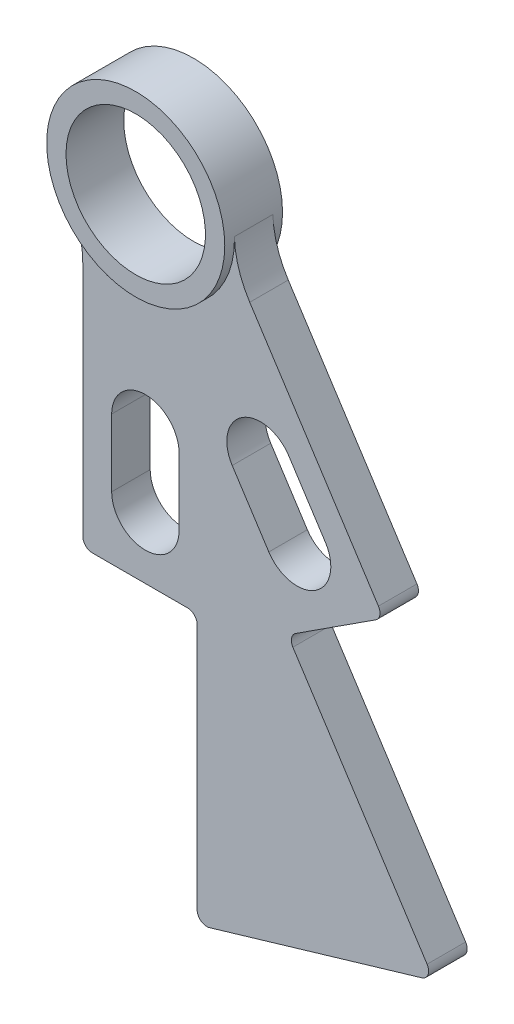
ISO-10303-21;
HEADER;
FILE_DESCRIPTION(('STEP AP214'),'2;1');
FILE_NAME('part.step','',(''),(''),'','','');
FILE_SCHEMA(('AUTOMOTIVE_DESIGN { 1 0 10303 214 1 1 1 1 }'));
ENDSEC;
DATA;
#1=APPLICATION_CONTEXT('core data for automotive mechanical design processes');
#2=APPLICATION_PROTOCOL_DEFINITION('international standard','automotive_design',2000,#1);
#3=PRODUCT_CONTEXT('',#1,'mechanical');
#4=PRODUCT('Part','Part','',(#3));
#5=PRODUCT_RELATED_PRODUCT_CATEGORY('part','',(#4));
#6=PRODUCT_DEFINITION_FORMATION('','',#4);
#7=PRODUCT_DEFINITION_CONTEXT('part definition',#1,'design');
#8=PRODUCT_DEFINITION('design','',#6,#7);
#9=PRODUCT_DEFINITION_SHAPE('','',#8);
#10=(LENGTH_UNIT() NAMED_UNIT(*) SI_UNIT(.MILLI.,.METRE.));
#11=(NAMED_UNIT(*) PLANE_ANGLE_UNIT() SI_UNIT($,.RADIAN.));
#12=(NAMED_UNIT(*) SI_UNIT($,.STERADIAN.) SOLID_ANGLE_UNIT());
#13=UNCERTAINTY_MEASURE_WITH_UNIT(LENGTH_MEASURE(1.E-05),#10,'distance_accuracy_value','');
#14=(GEOMETRIC_REPRESENTATION_CONTEXT(3) GLOBAL_UNCERTAINTY_ASSIGNED_CONTEXT((#13)) GLOBAL_UNIT_ASSIGNED_CONTEXT((#10,
#11,#12)) REPRESENTATION_CONTEXT('',''));
#15=CARTESIAN_POINT('',(0.,0.,0.));
#16=DIRECTION('',(0.,0.,1.));
#17=DIRECTION('',(1.,0.,0.));
#18=AXIS2_PLACEMENT_3D('',#15,#16,#17);
#19=CARTESIAN_POINT('',(0.,0.,4.7625));
#20=DIRECTION('',(0.,0.,-1.));
#21=DIRECTION('',(-1.,0.,0.));
#22=AXIS2_PLACEMENT_3D('',#19,#20,#21);
#23=CYLINDRICAL_SURFACE('',#22,11.495405);
#24=CARTESIAN_POINT('',(0.,0.,4.7625));
#25=DIRECTION('',(0.,0.,1.));
#26=DIRECTION('',(1.,0.,0.));
#27=AXIS2_PLACEMENT_3D('',#24,#25,#26);
#28=CIRCLE('',#27,11.495405);
#29=CARTESIAN_POINT('',(-11.495405,0.,4.7625));
#30=VERTEX_POINT('',#29);
#31=EDGE_CURVE('E278',#30,#30,#28,.T.);
#32=CARTESIAN_POINT('',(0.,0.,-4.7625));
#33=DIRECTION('',(0.,0.,1.));
#34=DIRECTION('',(1.,0.,0.));
#35=AXIS2_PLACEMENT_3D('',#32,#33,#34);
#36=CIRCLE('',#35,11.495405);
#37=CARTESIAN_POINT('',(-11.495405,0.,-4.7625));
#38=VERTEX_POINT('',#37);
#39=EDGE_CURVE('E288',#38,#38,#36,.T.);
#40=CARTESIAN_POINT('',(-11.495405,0.,4.7625));
#41=CARTESIAN_POINT('',(-11.495405,0.,4.66328125));
#42=CARTESIAN_POINT('',(-11.495405,0.,4.5640625));
#43=CARTESIAN_POINT('',(-11.495405,0.,4.365625));
#44=CARTESIAN_POINT('',(-11.495405,0.,4.26640625));
#45=CARTESIAN_POINT('',(-11.495405,0.,4.06796875));
#46=CARTESIAN_POINT('',(-11.495405,0.,3.96875));
#47=CARTESIAN_POINT('',(-11.495405,0.,3.7703125));
#48=CARTESIAN_POINT('',(-11.495405,0.,3.67109375));
#49=CARTESIAN_POINT('',(-11.495405,0.,3.47265625));
#50=CARTESIAN_POINT('',(-11.495405,0.,3.3734375));
#51=CARTESIAN_POINT('',(-11.495405,0.,3.175));
#52=CARTESIAN_POINT('',(-11.495405,0.,3.07578125));
#53=CARTESIAN_POINT('',(-11.495405,0.,2.87734375));
#54=CARTESIAN_POINT('',(-11.495405,0.,2.778125));
#55=CARTESIAN_POINT('',(-11.495405,0.,2.5796875));
#56=CARTESIAN_POINT('',(-11.495405,0.,2.48046875));
#57=CARTESIAN_POINT('',(-11.495405,0.,2.28203125));
#58=CARTESIAN_POINT('',(-11.495405,0.,2.1828125));
#59=CARTESIAN_POINT('',(-11.495405,0.,1.984375));
#60=CARTESIAN_POINT('',(-11.495405,0.,1.88515625));
#61=CARTESIAN_POINT('',(-11.495405,0.,1.68671875));
#62=CARTESIAN_POINT('',(-11.495405,0.,1.5875));
#63=CARTESIAN_POINT('',(-11.495405,0.,1.3890625));
#64=CARTESIAN_POINT('',(-11.495405,0.,1.28984375));
#65=CARTESIAN_POINT('',(-11.495405,0.,1.09140625));
#66=CARTESIAN_POINT('',(-11.495405,0.,0.992187499999999));
#67=CARTESIAN_POINT('',(-11.495405,0.,0.79375));
#68=CARTESIAN_POINT('',(-11.495405,0.,0.69453125));
#69=CARTESIAN_POINT('',(-11.495405,0.,0.49609375));
#70=CARTESIAN_POINT('',(-11.495405,0.,0.396875));
#71=CARTESIAN_POINT('',(-11.495405,0.,0.1984375));
#72=CARTESIAN_POINT('',(-11.495405,0.,0.0992187500000001));
#73=CARTESIAN_POINT('',(-11.495405,0.,-0.0992187500000001));
#74=CARTESIAN_POINT('',(-11.495405,0.,-0.1984375));
#75=CARTESIAN_POINT('',(-11.495405,0.,-0.396875));
#76=CARTESIAN_POINT('',(-11.495405,0.,-0.49609375));
#77=CARTESIAN_POINT('',(-11.495405,0.,-0.69453125));
#78=CARTESIAN_POINT('',(-11.495405,0.,-0.793750000000001));
#79=CARTESIAN_POINT('',(-11.495405,0.,-0.992187500000001));
#80=CARTESIAN_POINT('',(-11.495405,0.,-1.09140625));
#81=CARTESIAN_POINT('',(-11.495405,0.,-1.28984375));
#82=CARTESIAN_POINT('',(-11.495405,0.,-1.3890625));
#83=CARTESIAN_POINT('',(-11.495405,0.,-1.5875));
#84=CARTESIAN_POINT('',(-11.495405,0.,-1.68671875));
#85=CARTESIAN_POINT('',(-11.495405,0.,-1.88515625));
#86=CARTESIAN_POINT('',(-11.495405,0.,-1.984375));
#87=CARTESIAN_POINT('',(-11.495405,0.,-2.1828125));
#88=CARTESIAN_POINT('',(-11.495405,0.,-2.28203125));
#89=CARTESIAN_POINT('',(-11.495405,0.,-2.48046875));
#90=CARTESIAN_POINT('',(-11.495405,0.,-2.5796875));
#91=CARTESIAN_POINT('',(-11.495405,0.,-2.778125));
#92=CARTESIAN_POINT('',(-11.495405,0.,-2.87734375));
#93=CARTESIAN_POINT('',(-11.495405,0.,-3.07578125));
#94=CARTESIAN_POINT('',(-11.495405,0.,-3.175));
#95=CARTESIAN_POINT('',(-11.495405,0.,-3.3734375));
#96=CARTESIAN_POINT('',(-11.495405,0.,-3.47265625));
#97=CARTESIAN_POINT('',(-11.495405,0.,-3.67109375));
#98=CARTESIAN_POINT('',(-11.495405,0.,-3.7703125));
#99=CARTESIAN_POINT('',(-11.495405,0.,-3.96875));
#100=CARTESIAN_POINT('',(-11.495405,0.,-4.06796875));
#101=CARTESIAN_POINT('',(-11.495405,0.,-4.26640625));
#102=CARTESIAN_POINT('',(-11.495405,0.,-4.365625));
#103=CARTESIAN_POINT('',(-11.495405,0.,-4.5640625));
#104=CARTESIAN_POINT('',(-11.495405,0.,-4.66328125));
#105=CARTESIAN_POINT('',(-11.495405,0.,-4.7625));
#106=B_SPLINE_CURVE_WITH_KNOTS('',3,(#40,#41,#42,#43,#44,#45,#46,#47,#48,#49,#50,#51,#52,#53,
#54,#55,#56,#57,#58,#59,#60,#61,#62,#63,#64,#65,#66,#67,#68,#69,#70,#71,#72,#73,#74,#75,#76,#77,
#78,#79,#80,#81,#82,#83,#84,#85,#86,#87,#88,#89,#90,#91,#92,#93,#94,#95,#96,#97,#98,#99,#100,
#101,#102,#103,#104,#105),.UNSPECIFIED.,.F.,.F.,(4,2,2,2,2,2,2,2,2,2,2,2,2,2,2,2,2,2,2,2,2,2,2,
2,2,2,2,2,2,2,2,2,4),(0.,0.29765625,0.5953125,0.892968750000001,1.190625,1.48828125,1.7859375,
2.08359375,2.38125,2.67890625,2.9765625,3.27421875,3.571875,3.86953125,4.1671875,4.46484375,
4.7625,5.06015625,5.3578125,5.65546875,5.953125,6.25078125,6.5484375,6.84609375,7.14375,
7.44140625,7.7390625,8.03671875,8.334375,8.63203125,8.9296875,9.22734375,9.525),.UNSPECIFIED.);
#107=EDGE_CURVE('BSEAM52',#30,#38,#106,.T.);
#108=ORIENTED_EDGE('',*,*,#31,.T.);
#109=ORIENTED_EDGE('',*,*,#39,.F.);
#110=ORIENTED_EDGE('',*,*,#107,.T.);
#111=ORIENTED_EDGE('',*,*,#107,.F.);
#112=EDGE_LOOP('',(#108,#110,#109,#111));
#113=FACE_BOUND('',#112,.T.);
#114=ADVANCED_FACE('F52',(#113),#23,.F.);
#115=CARTESIAN_POINT('',(0.,0.,4.7625));
#116=DIRECTION('',(0.,0.,-1.));
#117=DIRECTION('',(-1.,0.,0.));
#118=AXIS2_PLACEMENT_3D('',#115,#116,#117);
#119=CYLINDRICAL_SURFACE('',#118,14.6812);
#120=DIRECTION('',(0.,0.,-1.));
#121=VECTOR('',#120,1.);
#122=CARTESIAN_POINT('',(-12.5851932668327,-7.5597978727258,3.175));
#123=LINE('',#122,#121);
#124=CARTESIAN_POINT('',(-12.5851932668327,-7.5597978727258,3.175));
#125=VERTEX_POINT('',#124);
#126=CARTESIAN_POINT('',(-12.5851932668327,-7.5597978727258,-3.175));
#127=VERTEX_POINT('',#126);
#128=EDGE_CURVE('E268',#125,#127,#123,.T.);
#129=ORIENTED_EDGE('',*,*,#128,.F.);
#130=CARTESIAN_POINT('',(0.,0.,3.175));
#131=DIRECTION('',(0.,0.,1.));
#132=DIRECTION('',(1.,0.,0.));
#133=AXIS2_PLACEMENT_3D('',#130,#131,#132);
#134=CIRCLE('',#133,14.6812);
#135=CARTESIAN_POINT('',(14.6729838648991,0.491098707400019,3.175));
#136=VERTEX_POINT('',#135);
#137=EDGE_CURVE('E246',#125,#136,#134,.T.);
#138=ORIENTED_EDGE('',*,*,#137,.T.);
#139=DIRECTION('',(0.,0.,-1.));
#140=VECTOR('',#139,1.);
#141=CARTESIAN_POINT('',(14.6729838648991,0.491098707400019,3.175));
#142=LINE('',#141,#140);
#143=CARTESIAN_POINT('',(14.6729838648991,0.491098707400019,-3.175));
#144=VERTEX_POINT('',#143);
#145=EDGE_CURVE('E242',#136,#144,#142,.T.);
#146=ORIENTED_EDGE('',*,*,#145,.T.);
#147=CARTESIAN_POINT('',(0.,0.,-3.175));
#148=DIRECTION('',(0.,0.,1.));
#149=DIRECTION('',(1.,0.,0.));
#150=AXIS2_PLACEMENT_3D('',#147,#148,#149);
#151=CIRCLE('',#150,14.6812);
#152=EDGE_CURVE('E466',#127,#144,#151,.T.);
#153=ORIENTED_EDGE('',*,*,#152,.F.);
#154=EDGE_LOOP('',(#129,#138,#146,#153));
#155=FACE_BOUND('',#154,.T.);
#156=CARTESIAN_POINT('',(0.,0.,4.7625));
#157=DIRECTION('',(0.,0.,1.));
#158=DIRECTION('',(1.,0.,0.));
#159=AXIS2_PLACEMENT_3D('',#156,#157,#158);
#160=CIRCLE('',#159,14.6812);
#161=CARTESIAN_POINT('',(14.6812,0.,4.7625));
#162=VERTEX_POINT('',#161);
#163=EDGE_CURVE('E282',#162,#162,#160,.T.);
#164=ORIENTED_EDGE('',*,*,#163,.F.);
#165=EDGE_LOOP('',(#164));
#166=FACE_BOUND('',#165,.T.);
#167=CARTESIAN_POINT('',(0.,0.,-4.7625));
#168=DIRECTION('',(0.,0.,1.));
#169=DIRECTION('',(1.,0.,0.));
#170=AXIS2_PLACEMENT_3D('',#167,#168,#169);
#171=CIRCLE('',#170,14.6812);
#172=CARTESIAN_POINT('',(14.6812,0.,-4.7625));
#173=VERTEX_POINT('',#172);
#174=EDGE_CURVE('E283',#173,#173,#171,.T.);
#175=ORIENTED_EDGE('',*,*,#174,.T.);
#176=EDGE_LOOP('',(#175));
#177=FACE_BOUND('',#176,.T.);
#178=ADVANCED_FACE('F577',(#155,#166,#177),#119,.T.);
#179=CARTESIAN_POINT('',(0.,0.,4.7625));
#180=DIRECTION('',(0.,0.,1.));
#181=DIRECTION('',(1.,0.,0.));
#182=AXIS2_PLACEMENT_3D('',#179,#180,#181);
#183=PLANE('',#182);
#184=ORIENTED_EDGE('',*,*,#31,.F.);
#185=EDGE_LOOP('',(#184));
#186=FACE_BOUND('',#185,.T.);
#187=ORIENTED_EDGE('',*,*,#163,.T.);
#188=EDGE_LOOP('',(#187));
#189=FACE_BOUND('',#188,.T.);
#190=ADVANCED_FACE('F595',(#186,#189),#183,.T.);
#191=CARTESIAN_POINT('',(0.,0.,-4.7625));
#192=DIRECTION('',(0.,0.,1.));
#193=DIRECTION('',(1.,0.,0.));
#194=AXIS2_PLACEMENT_3D('',#191,#192,#193);
#195=PLANE('',#194);
#196=ORIENTED_EDGE('',*,*,#39,.T.);
#197=EDGE_LOOP('',(#196));
#198=FACE_BOUND('',#197,.T.);
#199=ORIENTED_EDGE('',*,*,#174,.F.);
#200=EDGE_LOOP('',(#199));
#201=FACE_BOUND('',#200,.T.);
#202=ADVANCED_FACE('F791',(#198,#201),#195,.F.);
#203=CARTESIAN_POINT('',(0.,-34.9430697939241,3.175));
#204=DIRECTION('',(0.,0.,-1.));
#205=DIRECTION('',(-1.,0.,0.));
#206=AXIS2_PLACEMENT_3D('',#203,#204,#205);
#207=CYLINDRICAL_SURFACE('',#206,5.55625000000368);
#208=CARTESIAN_POINT('',(0.,-34.9430697939241,-3.175));
#209=DIRECTION('',(0.,0.,1.));
#210=DIRECTION('',(1.,0.,0.));
#211=AXIS2_PLACEMENT_3D('',#208,#209,#210);
#212=CIRCLE('',#211,5.55625000000368);
#213=CARTESIAN_POINT('',(5.55625000000371,-34.9430697939241,-3.175));
#214=VERTEX_POINT('',#213);
#215=CARTESIAN_POINT('',(-5.55625000000365,-34.9430697939241,-3.175));
#216=VERTEX_POINT('',#215);
#217=EDGE_CURVE('E427',#214,#216,#212,.T.);
#218=ORIENTED_EDGE('',*,*,#217,.F.);
#219=DIRECTION('',(0.,0.,-1.));
#220=VECTOR('',#219,1.);
#221=CARTESIAN_POINT('',(5.55625000000371,-34.9430697939241,3.175));
#222=LINE('',#221,#220);
#223=CARTESIAN_POINT('',(5.55625000000371,-34.9430697939241,3.175));
#224=VERTEX_POINT('',#223);
#225=EDGE_CURVE('E292',#224,#214,#222,.T.);
#226=ORIENTED_EDGE('',*,*,#225,.F.);
#227=CARTESIAN_POINT('',(0.,-34.9430697939241,3.175));
#228=DIRECTION('',(0.,0.,1.));
#229=DIRECTION('',(1.,0.,0.));
#230=AXIS2_PLACEMENT_3D('',#227,#228,#229);
#231=CIRCLE('',#230,5.55625000000368);
#232=CARTESIAN_POINT('',(-5.55625000000365,-34.9430697939241,3.175));
#233=VERTEX_POINT('',#232);
#234=EDGE_CURVE('E363',#224,#233,#231,.T.);
#235=ORIENTED_EDGE('',*,*,#234,.T.);
#236=DIRECTION('',(0.,0.,-1.));
#237=VECTOR('',#236,1.);
#238=CARTESIAN_POINT('',(-5.55625000000365,-34.9430697939241,3.175));
#239=LINE('',#238,#237);
#240=EDGE_CURVE('E411',#233,#216,#239,.T.);
#241=ORIENTED_EDGE('',*,*,#240,.T.);
#242=EDGE_LOOP('',(#218,#226,#235,#241));
#243=FACE_BOUND('',#242,.T.);
#244=ADVANCED_FACE('F782',(#243),#207,.F.);
#245=CARTESIAN_POINT('',(5.55625000000371,0.,3.175));
#246=DIRECTION('',(-1.,0.,0.));
#247=DIRECTION('',(0.,0.,1.));
#248=AXIS2_PLACEMENT_3D('',#245,#246,#247);
#249=PLANE('',#248);
#250=DIRECTION('',(0.,1.,0.));
#251=VECTOR('',#250,1.);
#252=CARTESIAN_POINT('',(5.55625000000371,0.,-3.175));
#253=LINE('',#252,#251);
#254=CARTESIAN_POINT('',(5.55625000000371,-46.0555697939241,-3.175));
#255=VERTEX_POINT('',#254);
#256=EDGE_CURVE('E423',#255,#214,#253,.T.);
#257=ORIENTED_EDGE('',*,*,#256,.F.);
#258=DIRECTION('',(0.,0.,-1.));
#259=VECTOR('',#258,1.);
#260=CARTESIAN_POINT('',(5.55625000000371,-46.0555697939241,3.175));
#261=LINE('',#260,#259);
#262=CARTESIAN_POINT('',(5.55625000000371,-46.0555697939241,3.175));
#263=VERTEX_POINT('',#262);
#264=EDGE_CURVE('E393',#263,#255,#261,.T.);
#265=ORIENTED_EDGE('',*,*,#264,.F.);
#266=DIRECTION('',(0.,1.,0.));
#267=VECTOR('',#266,1.);
#268=CARTESIAN_POINT('',(5.55625000000371,0.,3.175));
#269=LINE('',#268,#267);
#270=EDGE_CURVE('E370',#263,#224,#269,.T.);
#271=ORIENTED_EDGE('',*,*,#270,.T.);
#272=ORIENTED_EDGE('',*,*,#225,.T.);
#273=EDGE_LOOP('',(#257,#265,#271,#272));
#274=FACE_BOUND('',#273,.T.);
#275=ADVANCED_FACE('F773',(#274),#249,.T.);
#276=CARTESIAN_POINT('',(0.,-46.0555697939241,3.175));
#277=DIRECTION('',(0.,0.,-1.));
#278=DIRECTION('',(-1.,0.,0.));
#279=AXIS2_PLACEMENT_3D('',#276,#277,#278);
#280=CYLINDRICAL_SURFACE('',#279,5.55625000000368);
#281=CARTESIAN_POINT('',(0.,-46.0555697939241,-3.175));
#282=DIRECTION('',(0.,0.,1.));
#283=DIRECTION('',(1.,0.,0.));
#284=AXIS2_PLACEMENT_3D('',#281,#282,#283);
#285=CIRCLE('',#284,5.55625000000368);
#286=CARTESIAN_POINT('',(-5.55625000000365,-46.0555697939241,-3.175));
#287=VERTEX_POINT('',#286);
#288=EDGE_CURVE('E419',#287,#255,#285,.T.);
#289=ORIENTED_EDGE('',*,*,#288,.F.);
#290=DIRECTION('',(0.,0.,-1.));
#291=VECTOR('',#290,1.);
#292=CARTESIAN_POINT('',(-5.55625000000365,-46.0555697939241,3.175));
#293=LINE('',#292,#291);
#294=CARTESIAN_POINT('',(-5.55625000000365,-46.0555697939241,3.175));
#295=VERTEX_POINT('',#294);
#296=EDGE_CURVE('E407',#295,#287,#293,.T.);
#297=ORIENTED_EDGE('',*,*,#296,.F.);
#298=CARTESIAN_POINT('',(0.,-46.0555697939241,3.175));
#299=DIRECTION('',(0.,0.,1.));
#300=DIRECTION('',(1.,0.,0.));
#301=AXIS2_PLACEMENT_3D('',#298,#299,#300);
#302=CIRCLE('',#301,5.55625000000368);
#303=EDGE_CURVE('E374',#295,#263,#302,.T.);
#304=ORIENTED_EDGE('',*,*,#303,.T.);
#305=ORIENTED_EDGE('',*,*,#264,.T.);
#306=EDGE_LOOP('',(#289,#297,#304,#305));
#307=FACE_BOUND('',#306,.T.);
#308=ADVANCED_FACE('F764',(#307),#280,.F.);
#309=CARTESIAN_POINT('',(18.9851807063147,-29.3356615772007,3.175));
#310=DIRECTION('',(0.,0.,-1.));
#311=DIRECTION('',(-1.,0.,0.));
#312=AXIS2_PLACEMENT_3D('',#309,#310,#311);
#313=CYLINDRICAL_SURFACE('',#312,5.55625000000375);
#314=CARTESIAN_POINT('',(18.9851807063147,-29.3356615772007,-3.175));
#315=DIRECTION('',(0.,0.,1.));
#316=DIRECTION('',(1.,0.,0.));
#317=AXIS2_PLACEMENT_3D('',#314,#315,#316);
#318=CIRCLE('',#317,5.55625000000375);
#319=CARTESIAN_POINT('',(23.6498043527107,-26.3168538158445,-3.175));
#320=VERTEX_POINT('',#319);
#321=CARTESIAN_POINT('',(14.3205570599188,-32.3544693385572,-3.175));
#322=VERTEX_POINT('',#321);
#323=EDGE_CURVE('E443',#320,#322,#318,.T.);
#324=ORIENTED_EDGE('',*,*,#323,.F.);
#325=DIRECTION('',(0.,0.,-1.));
#326=VECTOR('',#325,1.);
#327=CARTESIAN_POINT('',(23.6498043527107,-26.3168538158445,3.175));
#328=LINE('',#327,#326);
#329=CARTESIAN_POINT('',(23.6498043527107,-26.3168538158445,3.175));
#330=VERTEX_POINT('',#329);
#331=EDGE_CURVE('E404',#330,#320,#328,.T.);
#332=ORIENTED_EDGE('',*,*,#331,.F.);
#333=CARTESIAN_POINT('',(18.9851807063147,-29.3356615772007,3.175));
#334=DIRECTION('',(0.,0.,1.));
#335=DIRECTION('',(1.,0.,0.));
#336=AXIS2_PLACEMENT_3D('',#333,#334,#335);
#337=CIRCLE('',#336,5.55625000000375);
#338=CARTESIAN_POINT('',(14.3205570599188,-32.3544693385572,3.175));
#339=VERTEX_POINT('',#338);
#340=EDGE_CURVE('E353',#330,#339,#337,.T.);
#341=ORIENTED_EDGE('',*,*,#340,.T.);
#342=DIRECTION('',(0.,0.,-1.));
#343=VECTOR('',#342,1.);
#344=CARTESIAN_POINT('',(14.3205570599188,-32.3544693385572,3.175));
#345=LINE('',#344,#343);
#346=EDGE_CURVE('E241',#339,#322,#345,.T.);
#347=ORIENTED_EDGE('',*,*,#346,.T.);
#348=EDGE_LOOP('',(#324,#332,#341,#347));
#349=FACE_BOUND('',#348,.T.);
#350=ADVANCED_FACE('F755',(#349),#313,.F.);
#351=CARTESIAN_POINT('',(4.66462364639593,3.0188077613563,3.175));
#352=DIRECTION('',(-0.839527315436279,-0.543317482358478,0.));
#353=DIRECTION('',(0.543317482358478,-0.839527315436279,0.));
#354=AXIS2_PLACEMENT_3D('',#351,#352,#353);
#355=PLANE('',#354);
#356=DIRECTION('',(-0.543317482358478,0.839527315436279,0.));
#357=VECTOR('',#356,1.);
#358=CARTESIAN_POINT('',(4.66462364639593,3.0188077613563,-3.175));
#359=LINE('',#358,#357);
#360=CARTESIAN_POINT('',(29.6874198754193,-35.6461011086302,-3.175));
#361=VERTEX_POINT('',#360);
#362=EDGE_CURVE('E439',#361,#320,#359,.T.);
#363=ORIENTED_EDGE('',*,*,#362,.F.);
#364=DIRECTION('',(0.,0.,-1.));
#365=VECTOR('',#364,1.);
#366=CARTESIAN_POINT('',(29.6874198754193,-35.6461011086302,3.175));
#367=LINE('',#366,#365);
#368=CARTESIAN_POINT('',(29.6874198754193,-35.6461011086302,3.175));
#369=VERTEX_POINT('',#368);
#370=EDGE_CURVE('E401',#369,#361,#367,.T.);
#371=ORIENTED_EDGE('',*,*,#370,.F.);
#372=DIRECTION('',(-0.543317482358478,0.839527315436279,0.));
#373=VECTOR('',#372,1.);
#374=CARTESIAN_POINT('',(4.66462364639593,3.0188077613563,3.175));
#375=LINE('',#374,#373);
#376=EDGE_CURVE('E348',#369,#330,#375,.T.);
#377=ORIENTED_EDGE('',*,*,#376,.T.);
#378=ORIENTED_EDGE('',*,*,#331,.T.);
#379=EDGE_LOOP('',(#363,#371,#377,#378));
#380=FACE_BOUND('',#379,.T.);
#381=ADVANCED_FACE('F746',(#380),#355,.T.);
#382=CARTESIAN_POINT('',(25.0227962290233,-38.6649088699864,3.175));
#383=DIRECTION('',(0.,0.,-1.));
#384=DIRECTION('',(-1.,0.,0.));
#385=AXIS2_PLACEMENT_3D('',#382,#383,#384);
#386=CYLINDRICAL_SURFACE('',#385,5.55625000000375);
#387=CARTESIAN_POINT('',(25.0227962290233,-38.6649088699864,-3.175));
#388=DIRECTION('',(0.,0.,1.));
#389=DIRECTION('',(1.,0.,0.));
#390=AXIS2_PLACEMENT_3D('',#387,#388,#389);
#391=CIRCLE('',#390,5.55625000000375);
#392=CARTESIAN_POINT('',(20.3581725826273,-41.6837166313428,-3.175));
#393=VERTEX_POINT('',#392);
#394=EDGE_CURVE('E435',#393,#361,#391,.T.);
#395=ORIENTED_EDGE('',*,*,#394,.F.);
#396=DIRECTION('',(0.,0.,-1.));
#397=VECTOR('',#396,1.);
#398=CARTESIAN_POINT('',(20.3581725826273,-41.6837166313428,3.175));
#399=LINE('',#398,#397);
#400=CARTESIAN_POINT('',(20.3581725826273,-41.6837166313428,3.175));
#401=VERTEX_POINT('',#400);
#402=EDGE_CURVE('E397',#401,#393,#399,.T.);
#403=ORIENTED_EDGE('',*,*,#402,.F.);
#404=CARTESIAN_POINT('',(25.0227962290233,-38.6649088699864,3.175));
#405=DIRECTION('',(0.,0.,1.));
#406=DIRECTION('',(1.,0.,0.));
#407=AXIS2_PLACEMENT_3D('',#404,#405,#406);
#408=CIRCLE('',#407,5.55625000000375);
#409=EDGE_CURVE('E352',#401,#369,#408,.T.);
#410=ORIENTED_EDGE('',*,*,#409,.T.);
#411=ORIENTED_EDGE('',*,*,#370,.T.);
#412=EDGE_LOOP('',(#395,#403,#410,#411));
#413=FACE_BOUND('',#412,.T.);
#414=ADVANCED_FACE('F738',(#413),#386,.F.);
#415=CARTESIAN_POINT('',(-7.17019291931245,-4.6403387874532,3.175));
#416=DIRECTION('',(0.839527315436279,0.543317482358478,0.));
#417=DIRECTION('',(-0.543317482358478,0.839527315436279,0.));
#418=AXIS2_PLACEMENT_3D('',#415,#416,#417);
#419=PLANE('',#418);
#420=DIRECTION('',(0.543317482358478,-0.839527315436279,0.));
#421=VECTOR('',#420,1.);
#422=CARTESIAN_POINT('',(-7.17019291931245,-4.6403387874532,3.175));
#423=LINE('',#422,#421);
#424=CARTESIAN_POINT('',(24.3214770840415,-53.3008697568528,3.175));
#425=VERTEX_POINT('',#424);
#426=CARTESIAN_POINT('',(46.4553211421648,-87.5018061996475,3.175));
#427=VERTEX_POINT('',#426);
#428=EDGE_CURVE('E418',#425,#427,#423,.T.);
#429=ORIENTED_EDGE('',*,*,#428,.T.);
#430=DIRECTION('',(0.,0.,-1.));
#431=VECTOR('',#430,1.);
#432=CARTESIAN_POINT('',(46.4553211421648,-87.5018061996474,-3.175));
#433=LINE('',#432,#431);
#434=CARTESIAN_POINT('',(46.4553211421648,-87.5018061996475,-3.175));
#435=VERTEX_POINT('',#434);
#436=EDGE_CURVE('E497',#427,#435,#433,.T.);
#437=ORIENTED_EDGE('',*,*,#436,.T.);
#438=DIRECTION('',(0.543317482358478,-0.839527315436279,0.));
#439=VECTOR('',#438,1.);
#440=CARTESIAN_POINT('',(-7.17019291931245,-4.6403387874532,-3.175));
#441=LINE('',#440,#439);
#442=CARTESIAN_POINT('',(24.3214770840415,-53.3008697568528,-3.175));
#443=VERTEX_POINT('',#442);
#444=EDGE_CURVE('E383',#443,#435,#441,.T.);
#445=ORIENTED_EDGE('',*,*,#444,.F.);
#446=DIRECTION('',(0.,0.,-1.));
#447=VECTOR('',#446,1.);
#448=CARTESIAN_POINT('',(24.3214770840415,-53.3008697568528,3.175));
#449=LINE('',#448,#447);
#450=EDGE_CURVE('E494',#443,#425,#449,.F.);
#451=ORIENTED_EDGE('',*,*,#450,.T.);
#452=EDGE_LOOP('',(#429,#437,#445,#451));
#453=FACE_BOUND('',#452,.T.);
#454=ADVANCED_FACE('F493',(#453),#419,.T.);
#455=CARTESIAN_POINT('',(30.6291535001097,-47.3277813561446,3.175));
#456=DIRECTION('',(-0.543317482358476,0.83952731543628,0.));
#457=DIRECTION('',(-0.83952731543628,-0.543317482358476,0.));
#458=AXIS2_PLACEMENT_3D('',#455,#456,#457);
#459=PLANE('',#458);
#460=DIRECTION('',(0.83952731543628,0.543317482358476,0.));
#461=VECTOR('',#460,1.);
#462=CARTESIAN_POINT('',(30.6291535001097,-47.3277813561446,3.175));
#463=LINE('',#462,#461);
#464=CARTESIAN_POINT('',(24.7917101940525,-51.1056036403536,3.175));
#465=VERTEX_POINT('',#464);
#466=CARTESIAN_POINT('',(37.9592763730128,-42.5839405883021,3.175));
#467=VERTEX_POINT('',#466);
#468=EDGE_CURVE('E230',#465,#467,#463,.T.);
#469=ORIENTED_EDGE('',*,*,#468,.F.);
#470=DIRECTION('',(0.,0.,-1.));
#471=VECTOR('',#470,1.);
#472=CARTESIAN_POINT('',(24.7917101940525,-51.1056036403536,3.175));
#473=LINE('',#472,#471);
#474=CARTESIAN_POINT('',(24.7917101940525,-51.1056036403536,-3.175));
#475=VERTEX_POINT('',#474);
#476=EDGE_CURVE('E516',#465,#475,#473,.T.);
#477=ORIENTED_EDGE('',*,*,#476,.T.);
#478=DIRECTION('',(0.83952731543628,0.543317482358476,0.));
#479=VECTOR('',#478,1.);
#480=CARTESIAN_POINT('',(30.6291535001097,-47.3277813561446,-3.175));
#481=LINE('',#480,#479);
#482=CARTESIAN_POINT('',(37.9592763730128,-42.5839405883021,-3.175));
#483=VERTEX_POINT('',#482);
#484=EDGE_CURVE('E474',#475,#483,#481,.T.);
#485=ORIENTED_EDGE('',*,*,#484,.T.);
#486=DIRECTION('',(0.,0.,-1.));
#487=VECTOR('',#486,1.);
#488=CARTESIAN_POINT('',(37.9592763730128,-42.5839405883021,3.175));
#489=LINE('',#488,#487);
#490=EDGE_CURVE('E508',#483,#467,#489,.F.);
#491=ORIENTED_EDGE('',*,*,#490,.T.);
#492=EDGE_LOOP('',(#469,#477,#485,#491));
#493=FACE_BOUND('',#492,.T.);
#494=ADVANCED_FACE('F723',(#493),#459,.F.);
#495=CARTESIAN_POINT('',(8.66287248615813,5.60635727108654,3.175));
#496=DIRECTION('',(-0.839527315436279,-0.543317482358477,0.));
#497=DIRECTION('',(0.543317482358477,-0.83952731543628,0.));
#498=AXIS2_PLACEMENT_3D('',#495,#496,#497);
#499=PLANE('',#498);
#500=DIRECTION('',(-0.543317482358477,0.83952731543628,0.));
#501=VECTOR('',#500,1.);
#502=CARTESIAN_POINT('',(8.66287248615813,5.60635727108654,3.175));
#503=LINE('',#502,#501);
#504=CARTESIAN_POINT('',(38.4295094830239,-40.3886744718029,3.175));
#505=VERTEX_POINT('',#504);
#506=CARTESIAN_POINT('',(17.2116035032161,-7.60303398572244,3.175));
#507=VERTEX_POINT('',#506);
#508=EDGE_CURVE('E214',#505,#507,#503,.T.);
#509=ORIENTED_EDGE('',*,*,#508,.F.);
#510=DIRECTION('',(0.,0.,-1.));
#511=VECTOR('',#510,1.);
#512=CARTESIAN_POINT('',(38.4295094830239,-40.3886744718029,3.175));
#513=LINE('',#512,#511);
#514=CARTESIAN_POINT('',(38.4295094830239,-40.3886744718029,-3.175));
#515=VERTEX_POINT('',#514);
#516=EDGE_CURVE('E528',#505,#515,#513,.T.);
#517=ORIENTED_EDGE('',*,*,#516,.T.);
#518=DIRECTION('',(-0.543317482358477,0.83952731543628,0.));
#519=VECTOR('',#518,1.);
#520=CARTESIAN_POINT('',(8.66287248615813,5.60635727108654,-3.175));
#521=LINE('',#520,#519);
#522=CARTESIAN_POINT('',(17.2116035032161,-7.60303398572244,-3.175));
#523=VERTEX_POINT('',#522);
#524=EDGE_CURVE('E236',#515,#523,#521,.T.);
#525=ORIENTED_EDGE('',*,*,#524,.T.);
#526=DIRECTION('',(0.,0.,-1.));
#527=VECTOR('',#526,1.);
#528=CARTESIAN_POINT('',(17.2116035032161,-7.60303398572244,3.175));
#529=LINE('',#528,#527);
#530=EDGE_CURVE('E233',#507,#523,#529,.T.);
#531=ORIENTED_EDGE('',*,*,#530,.F.);
#532=EDGE_LOOP('',(#509,#517,#525,#531));
#533=FACE_BOUND('',#532,.T.);
#534=ADVANCED_FACE('F234',(#533),#499,.F.);
#535=CARTESIAN_POINT('',(30.5390996357642,1.02213104671653,3.175));
#536=DIRECTION('',(0.,0.,-1.));
#537=DIRECTION('',(-1.,0.,0.));
#538=AXIS2_PLACEMENT_3D('',#535,#536,#537);
#539=CYLINDRICAL_SURFACE('',#538,15.8749999999966);
#540=CARTESIAN_POINT('',(30.5390996357642,1.02213104671653,-3.175));
#541=DIRECTION('',(0.,0.,1.));
#542=DIRECTION('',(1.,0.,0.));
#543=AXIS2_PLACEMENT_3D('',#540,#541,#542);
#544=CIRCLE('',#543,15.8749999999966);
#545=EDGE_CURVE('E470',#523,#144,#544,.F.);
#546=ORIENTED_EDGE('',*,*,#545,.T.);
#547=ORIENTED_EDGE('',*,*,#145,.F.);
#548=CARTESIAN_POINT('',(30.5390996357642,1.02213104671653,3.175));
#549=DIRECTION('',(0.,0.,1.));
#550=DIRECTION('',(1.,0.,0.));
#551=AXIS2_PLACEMENT_3D('',#548,#549,#550);
#552=CIRCLE('',#551,15.8749999999966);
#553=EDGE_CURVE('E221',#507,#136,#552,.F.);
#554=ORIENTED_EDGE('',*,*,#553,.F.);
#555=ORIENTED_EDGE('',*,*,#530,.T.);
#556=EDGE_LOOP('',(#546,#547,#554,#555));
#557=FACE_BOUND('',#556,.T.);
#558=ADVANCED_FACE('F244',(#557),#539,.F.);
#559=CARTESIAN_POINT('',(-26.1937499999966,-15.7343197939241,3.175));
#560=DIRECTION('',(0.,0.,-1.));
#561=DIRECTION('',(-1.,0.,0.));
#562=AXIS2_PLACEMENT_3D('',#559,#560,#561);
#563=CYLINDRICAL_SURFACE('',#562,15.8749999999966);
#564=CARTESIAN_POINT('',(-26.1937499999966,-15.7343197939241,-3.175));
#565=DIRECTION('',(0.,0.,1.));
#566=DIRECTION('',(1.,0.,0.));
#567=AXIS2_PLACEMENT_3D('',#564,#565,#566);
#568=CIRCLE('',#567,15.8749999999966);
#569=CARTESIAN_POINT('',(-10.31875,-15.7343197939241,-3.175));
#570=VERTEX_POINT('',#569);
#571=EDGE_CURVE('E462',#570,#127,#568,.T.);
#572=ORIENTED_EDGE('',*,*,#571,.F.);
#573=DIRECTION('',(0.,0.,-1.));
#574=VECTOR('',#573,1.);
#575=CARTESIAN_POINT('',(-10.31875,-15.7343197939241,3.175));
#576=LINE('',#575,#574);
#577=CARTESIAN_POINT('',(-10.31875,-15.7343197939241,3.175));
#578=VERTEX_POINT('',#577);
#579=EDGE_CURVE('E274',#578,#570,#576,.T.);
#580=ORIENTED_EDGE('',*,*,#579,.F.);
#581=CARTESIAN_POINT('',(-26.1937499999966,-15.7343197939241,3.175));
#582=DIRECTION('',(0.,0.,1.));
#583=DIRECTION('',(1.,0.,0.));
#584=AXIS2_PLACEMENT_3D('',#581,#582,#583);
#585=CIRCLE('',#584,15.8749999999966);
#586=EDGE_CURVE('E250',#578,#125,#585,.T.);
#587=ORIENTED_EDGE('',*,*,#586,.T.);
#588=ORIENTED_EDGE('',*,*,#128,.T.);
#589=EDGE_LOOP('',(#572,#580,#587,#588));
#590=FACE_BOUND('',#589,.T.);
#591=ADVANCED_FACE('F575',(#590),#563,.F.);
#592=CARTESIAN_POINT('',(-10.31875,0.,3.175));
#593=DIRECTION('',(1.,0.,0.));
#594=DIRECTION('',(0.,0.,-1.));
#595=AXIS2_PLACEMENT_3D('',#592,#593,#594);
#596=PLANE('',#595);
#597=DIRECTION('',(0.,-1.,0.));
#598=VECTOR('',#597,1.);
#599=CARTESIAN_POINT('',(-10.31875,0.,-3.175));
#600=LINE('',#599,#598);
#601=CARTESIAN_POINT('',(-10.31875,-54.7868197939241,-3.175));
#602=VERTEX_POINT('',#601);
#603=EDGE_CURVE('E458',#570,#602,#600,.T.);
#604=ORIENTED_EDGE('',*,*,#603,.T.);
#605=DIRECTION('',(0.,0.,-1.));
#606=VECTOR('',#605,1.);
#607=CARTESIAN_POINT('',(-10.31875,-54.7868197939241,3.175));
#608=LINE('',#607,#606);
#609=CARTESIAN_POINT('',(-10.31875,-54.7868197939241,3.175));
#610=VERTEX_POINT('',#609);
#611=EDGE_CURVE('E525',#602,#610,#608,.F.);
#612=ORIENTED_EDGE('',*,*,#611,.T.);
#613=DIRECTION('',(0.,-1.,0.));
#614=VECTOR('',#613,1.);
#615=CARTESIAN_POINT('',(-10.31875,0.,3.175));
#616=LINE('',#615,#614);
#617=EDGE_CURVE('E333',#578,#610,#616,.T.);
#618=ORIENTED_EDGE('',*,*,#617,.F.);
#619=ORIENTED_EDGE('',*,*,#579,.T.);
#620=EDGE_LOOP('',(#604,#612,#618,#619));
#621=FACE_BOUND('',#620,.T.);
#622=ADVANCED_FACE('F569',(#621),#596,.F.);
#623=CARTESIAN_POINT('',(-2.65364309406162E-13,-56.3743197939242,3.175));
#624=DIRECTION('',(0.,1.,0.));
#625=DIRECTION('',(-1.,0.,0.));
#626=AXIS2_PLACEMENT_3D('',#623,#624,#625);
#627=PLANE('',#626);
#628=DIRECTION('',(1.,0.,0.));
#629=VECTOR('',#628,1.);
#630=CARTESIAN_POINT('',(-2.65364309406162E-13,-56.3743197939242,-3.175));
#631=LINE('',#630,#629);
#632=CARTESIAN_POINT('',(-8.73124999999998,-56.3743197939241,-3.175));
#633=VERTEX_POINT('',#632);
#634=CARTESIAN_POINT('',(6.95325000000004,-56.3743197939242,-3.175));
#635=VERTEX_POINT('',#634);
#636=EDGE_CURVE('E455',#633,#635,#631,.T.);
#637=ORIENTED_EDGE('',*,*,#636,.T.);
#638=DIRECTION('',(0.,0.,-1.));
#639=VECTOR('',#638,1.);
#640=CARTESIAN_POINT('',(6.95325000000004,-56.3743197939242,3.175));
#641=LINE('',#640,#639);
#642=CARTESIAN_POINT('',(6.95325000000004,-56.3743197939242,3.175));
#643=VERTEX_POINT('',#642);
#644=EDGE_CURVE('E68',#635,#643,#641,.F.);
#645=ORIENTED_EDGE('',*,*,#644,.T.);
#646=DIRECTION('',(1.,0.,0.));
#647=VECTOR('',#646,1.);
#648=CARTESIAN_POINT('',(-2.65364309406162E-13,-56.3743197939242,3.175));
#649=LINE('',#648,#647);
#650=CARTESIAN_POINT('',(-8.73124999999998,-56.3743197939241,3.175));
#651=VERTEX_POINT('',#650);
#652=EDGE_CURVE('E337',#651,#643,#649,.T.);
#653=ORIENTED_EDGE('',*,*,#652,.F.);
#654=DIRECTION('',(0.,0.,-1.));
#655=VECTOR('',#654,1.);
#656=CARTESIAN_POINT('',(-8.73124999999998,-56.3743197939241,3.175));
#657=LINE('',#656,#655);
#658=EDGE_CURVE('E519',#651,#633,#657,.T.);
#659=ORIENTED_EDGE('',*,*,#658,.T.);
#660=EDGE_LOOP('',(#637,#645,#653,#659));
#661=FACE_BOUND('',#660,.T.);
#662=ADVANCED_FACE('F539',(#661),#627,.F.);
#663=CARTESIAN_POINT('',(8.54075000000003,0.,3.175));
#664=DIRECTION('',(1.,0.,0.));
#665=DIRECTION('',(0.,0.,-1.));
#666=AXIS2_PLACEMENT_3D('',#663,#664,#665);
#667=PLANE('',#666);
#668=DIRECTION('',(0.,-1.,0.));
#669=VECTOR('',#668,1.);
#670=CARTESIAN_POINT('',(8.54075000000003,0.,-3.175));
#671=LINE('',#670,#669);
#672=CARTESIAN_POINT('',(8.54075000000003,-57.9618197939242,-3.175));
#673=VERTEX_POINT('',#672);
#674=CARTESIAN_POINT('',(8.54075000000003,-98.7001445797257,-3.175));
#675=VERTEX_POINT('',#674);
#676=EDGE_CURVE('E451',#673,#675,#671,.T.);
#677=ORIENTED_EDGE('',*,*,#676,.T.);
#678=DIRECTION('',(0.,0.,-1.));
#679=VECTOR('',#678,1.);
#680=CARTESIAN_POINT('',(8.54075000000003,-98.7001445797257,3.175));
#681=LINE('',#680,#679);
#682=CARTESIAN_POINT('',(8.54075000000003,-98.7001445797257,3.175));
#683=VERTEX_POINT('',#682);
#684=EDGE_CURVE('E318',#675,#683,#681,.F.);
#685=ORIENTED_EDGE('',*,*,#684,.T.);
#686=DIRECTION('',(0.,-1.,0.));
#687=VECTOR('',#686,1.);
#688=CARTESIAN_POINT('',(8.54075000000003,0.,3.175));
#689=LINE('',#688,#687);
#690=CARTESIAN_POINT('',(8.54075000000003,-57.9618197939242,3.175));
#691=VERTEX_POINT('',#690);
#692=EDGE_CURVE('E340',#691,#683,#689,.T.);
#693=ORIENTED_EDGE('',*,*,#692,.F.);
#694=DIRECTION('',(0.,0.,-1.));
#695=VECTOR('',#694,1.);
#696=CARTESIAN_POINT('',(8.54075000000003,-57.9618197939242,-3.175));
#697=LINE('',#696,#695);
#698=EDGE_CURVE('E314',#691,#673,#697,.T.);
#699=ORIENTED_EDGE('',*,*,#698,.T.);
#700=EDGE_LOOP('',(#677,#685,#693,#699));
#701=FACE_BOUND('',#700,.T.);
#702=ADVANCED_FACE('F546',(#701),#667,.F.);
#703=CARTESIAN_POINT('',(-4.66462364639603,-3.01880776135636,3.175));
#704=DIRECTION('',(-0.839527315436279,-0.543317482358478,0.));
#705=DIRECTION('',(0.543317482358478,-0.839527315436279,0.));
#706=AXIS2_PLACEMENT_3D('',#703,#704,#705);
#707=PLANE('',#706);
#708=DIRECTION('',(-0.543317482358478,0.839527315436279,0.));
#709=VECTOR('',#708,1.);
#710=CARTESIAN_POINT('',(-4.66462364639603,-3.01880776135636,-3.175));
#711=LINE('',#710,#709);
#712=EDGE_CURVE('E431',#393,#322,#711,.T.);
#713=ORIENTED_EDGE('',*,*,#712,.T.);
#714=ORIENTED_EDGE('',*,*,#346,.F.);
#715=DIRECTION('',(-0.543317482358478,0.839527315436279,0.));
#716=VECTOR('',#715,1.);
#717=CARTESIAN_POINT('',(-4.66462364639603,-3.01880776135636,3.175));
#718=LINE('',#717,#716);
#719=EDGE_CURVE('E359',#401,#339,#718,.T.);
#720=ORIENTED_EDGE('',*,*,#719,.F.);
#721=ORIENTED_EDGE('',*,*,#402,.T.);
#722=EDGE_LOOP('',(#713,#714,#720,#721));
#723=FACE_BOUND('',#722,.T.);
#724=ADVANCED_FACE('F671',(#723),#707,.F.);
#725=CARTESIAN_POINT('',(28.0750863358015,-95.0547145543364,3.175));
#726=DIRECTION('',(-0.283260202431939,0.959043094818067,0.));
#727=DIRECTION('',(-0.959043094818068,-0.283260202431939,0.));
#728=AXIS2_PLACEMENT_3D('',#725,#726,#727);
#729=PLANE('',#728);
#730=DIRECTION('',(0.959043094818068,0.283260202431939,0.));
#731=VECTOR('',#730,1.);
#732=CARTESIAN_POINT('',(28.0750863358015,-95.0547145543364,3.175));
#733=LINE('',#732,#731);
#734=CARTESIAN_POINT('',(10.5779255713607,-100.222625492749,3.175));
#735=VERTEX_POINT('',#734);
#736=CARTESIAN_POINT('',(45.5722471002704,-89.8868036159152,3.175));
#737=VERTEX_POINT('',#736);
#738=EDGE_CURVE('E549',#735,#737,#733,.T.);
#739=ORIENTED_EDGE('',*,*,#738,.F.);
#740=DIRECTION('',(0.,0.,-1.));
#741=VECTOR('',#740,1.);
#742=CARTESIAN_POINT('',(10.5779255713607,-100.222625492749,3.175));
#743=LINE('',#742,#741);
#744=CARTESIAN_POINT('',(10.5779255713607,-100.222625492749,-3.175));
#745=VERTEX_POINT('',#744);
#746=EDGE_CURVE('E298',#735,#745,#743,.T.);
#747=ORIENTED_EDGE('',*,*,#746,.T.);
#748=DIRECTION('',(0.959043094818068,0.283260202431939,0.));
#749=VECTOR('',#748,1.);
#750=CARTESIAN_POINT('',(28.0750863358015,-95.0547145543364,-3.175));
#751=LINE('',#750,#749);
#752=CARTESIAN_POINT('',(45.5722471002704,-89.8868036159152,-3.175));
#753=VERTEX_POINT('',#752);
#754=EDGE_CURVE('E447',#745,#753,#751,.T.);
#755=ORIENTED_EDGE('',*,*,#754,.T.);
#756=DIRECTION('',(0.,0.,-1.));
#757=VECTOR('',#756,1.);
#758=CARTESIAN_POINT('',(45.5722471002704,-89.8868036159152,3.175));
#759=LINE('',#758,#757);
#760=EDGE_CURVE('E287',#753,#737,#759,.F.);
#761=ORIENTED_EDGE('',*,*,#760,.T.);
#762=EDGE_LOOP('',(#739,#747,#755,#761));
#763=FACE_BOUND('',#762,.T.);
#764=ADVANCED_FACE('F662',(#763),#729,.F.);
#765=CARTESIAN_POINT('',(-5.55625000000365,0.,3.175));
#766=DIRECTION('',(-1.,0.,0.));
#767=DIRECTION('',(0.,0.,1.));
#768=AXIS2_PLACEMENT_3D('',#765,#766,#767);
#769=PLANE('',#768);
#770=DIRECTION('',(0.,1.,0.));
#771=VECTOR('',#770,1.);
#772=CARTESIAN_POINT('',(-5.55625000000365,0.,-3.175));
#773=LINE('',#772,#771);
#774=EDGE_CURVE('E414',#287,#216,#773,.T.);
#775=ORIENTED_EDGE('',*,*,#774,.T.);
#776=ORIENTED_EDGE('',*,*,#240,.F.);
#777=DIRECTION('',(0.,1.,0.));
#778=VECTOR('',#777,1.);
#779=CARTESIAN_POINT('',(-5.55625000000365,0.,3.175));
#780=LINE('',#779,#778);
#781=EDGE_CURVE('E379',#295,#233,#780,.T.);
#782=ORIENTED_EDGE('',*,*,#781,.F.);
#783=ORIENTED_EDGE('',*,*,#296,.T.);
#784=EDGE_LOOP('',(#775,#776,#782,#783));
#785=FACE_BOUND('',#784,.T.);
#786=ADVANCED_FACE('F653',(#785),#769,.F.);
#787=CARTESIAN_POINT('',(0.,0.,3.175));
#788=DIRECTION('',(0.,0.,1.));
#789=DIRECTION('',(1.,0.,0.));
#790=AXIS2_PLACEMENT_3D('',#787,#788,#789);
#791=PLANE('',#790);
#792=ORIENTED_EDGE('',*,*,#692,.T.);
#793=CARTESIAN_POINT('',(10.12825,-98.7001445797257,3.175));
#794=DIRECTION('',(0.,0.,1.));
#795=DIRECTION('',(1.,0.,0.));
#796=AXIS2_PLACEMENT_3D('',#793,#794,#795);
#797=CIRCLE('',#796,1.5875);
#798=EDGE_CURVE('E504',#683,#735,#797,.T.);
#799=ORIENTED_EDGE('',*,*,#798,.T.);
#800=ORIENTED_EDGE('',*,*,#738,.T.);
#801=CARTESIAN_POINT('',(45.1225715289097,-88.3643227028915,3.175));
#802=DIRECTION('',(0.,0.,1.));
#803=DIRECTION('',(1.,0.,0.));
#804=AXIS2_PLACEMENT_3D('',#801,#802,#803);
#805=CIRCLE('',#804,1.5875);
#806=EDGE_CURVE('E510',#737,#427,#805,.T.);
#807=ORIENTED_EDGE('',*,*,#806,.T.);
#808=ORIENTED_EDGE('',*,*,#428,.F.);
#809=CARTESIAN_POINT('',(25.6542266972966,-52.4383532536087,3.175));
#810=DIRECTION('',(0.,0.,1.));
#811=DIRECTION('',(1.,0.,0.));
#812=AXIS2_PLACEMENT_3D('',#809,#810,#811);
#813=CIRCLE('',#812,1.5875);
#814=EDGE_CURVE('E502',#425,#465,#813,.F.);
#815=ORIENTED_EDGE('',*,*,#814,.T.);
#816=ORIENTED_EDGE('',*,*,#468,.T.);
#817=CARTESIAN_POINT('',(37.0967598697688,-41.251190975047,3.175));
#818=DIRECTION('',(0.,0.,1.));
#819=DIRECTION('',(1.,0.,0.));
#820=AXIS2_PLACEMENT_3D('',#817,#818,#819);
#821=CIRCLE('',#820,1.5875);
#822=EDGE_CURVE('E225',#467,#505,#821,.T.);
#823=ORIENTED_EDGE('',*,*,#822,.T.);
#824=ORIENTED_EDGE('',*,*,#508,.T.);
#825=ORIENTED_EDGE('',*,*,#553,.T.);
#826=ORIENTED_EDGE('',*,*,#137,.F.);
#827=ORIENTED_EDGE('',*,*,#586,.F.);
#828=ORIENTED_EDGE('',*,*,#617,.T.);
#829=CARTESIAN_POINT('',(-8.73124999999997,-54.7868197939241,3.175));
#830=DIRECTION('',(0.,0.,1.));
#831=DIRECTION('',(1.,0.,0.));
#832=AXIS2_PLACEMENT_3D('',#829,#830,#831);
#833=CIRCLE('',#832,1.5875);
#834=EDGE_CURVE('E75',#610,#651,#833,.T.);
#835=ORIENTED_EDGE('',*,*,#834,.T.);
#836=ORIENTED_EDGE('',*,*,#652,.T.);
#837=CARTESIAN_POINT('',(6.95325000000003,-57.9618197939242,3.175));
#838=DIRECTION('',(0.,0.,1.));
#839=DIRECTION('',(1.,0.,0.));
#840=AXIS2_PLACEMENT_3D('',#837,#838,#839);
#841=CIRCLE('',#840,1.5875);
#842=EDGE_CURVE('E12',#643,#691,#841,.F.);
#843=ORIENTED_EDGE('',*,*,#842,.T.);
#844=EDGE_LOOP('',(#792,#799,#800,#807,#808,#815,#816,#823,#824,#825,#826,#827,#828,#835,#836,#843));
#845=FACE_BOUND('',#844,.T.);
#846=ORIENTED_EDGE('',*,*,#340,.F.);
#847=ORIENTED_EDGE('',*,*,#376,.F.);
#848=ORIENTED_EDGE('',*,*,#409,.F.);
#849=ORIENTED_EDGE('',*,*,#719,.T.);
#850=EDGE_LOOP('',(#846,#847,#848,#849));
#851=FACE_BOUND('',#850,.T.);
#852=ORIENTED_EDGE('',*,*,#234,.F.);
#853=ORIENTED_EDGE('',*,*,#270,.F.);
#854=ORIENTED_EDGE('',*,*,#303,.F.);
#855=ORIENTED_EDGE('',*,*,#781,.T.);
#856=EDGE_LOOP('',(#852,#853,#854,#855));
#857=FACE_BOUND('',#856,.T.);
#858=ADVANCED_FACE('F217',(#845,#851,#857),#791,.T.);
#859=CARTESIAN_POINT('',(0.,0.,-3.175));
#860=DIRECTION('',(0.,0.,1.));
#861=DIRECTION('',(1.,0.,0.));
#862=AXIS2_PLACEMENT_3D('',#859,#860,#861);
#863=PLANE('',#862);
#864=ORIENTED_EDGE('',*,*,#754,.F.);
#865=CARTESIAN_POINT('',(10.12825,-98.7001445797257,-3.175));
#866=DIRECTION('',(0.,0.,1.));
#867=DIRECTION('',(1.,0.,0.));
#868=AXIS2_PLACEMENT_3D('',#865,#866,#867);
#869=CIRCLE('',#868,1.5875);
#870=EDGE_CURVE('E311',#745,#675,#869,.F.);
#871=ORIENTED_EDGE('',*,*,#870,.T.);
#872=ORIENTED_EDGE('',*,*,#676,.F.);
#873=CARTESIAN_POINT('',(6.95325000000003,-57.9618197939242,-3.175));
#874=DIRECTION('',(0.,0.,1.));
#875=DIRECTION('',(1.,0.,0.));
#876=AXIS2_PLACEMENT_3D('',#873,#874,#875);
#877=CIRCLE('',#876,1.5875);
#878=EDGE_CURVE('E61',#673,#635,#877,.T.);
#879=ORIENTED_EDGE('',*,*,#878,.T.);
#880=ORIENTED_EDGE('',*,*,#636,.F.);
#881=CARTESIAN_POINT('',(-8.73124999999997,-54.7868197939241,-3.175));
#882=DIRECTION('',(0.,0.,1.));
#883=DIRECTION('',(1.,0.,0.));
#884=AXIS2_PLACEMENT_3D('',#881,#882,#883);
#885=CIRCLE('',#884,1.5875);
#886=EDGE_CURVE('E305',#633,#602,#885,.F.);
#887=ORIENTED_EDGE('',*,*,#886,.T.);
#888=ORIENTED_EDGE('',*,*,#603,.F.);
#889=ORIENTED_EDGE('',*,*,#571,.T.);
#890=ORIENTED_EDGE('',*,*,#152,.T.);
#891=ORIENTED_EDGE('',*,*,#545,.F.);
#892=ORIENTED_EDGE('',*,*,#524,.F.);
#893=CARTESIAN_POINT('',(37.0967598697688,-41.251190975047,-3.175));
#894=DIRECTION('',(0.,0.,1.));
#895=DIRECTION('',(1.,0.,0.));
#896=AXIS2_PLACEMENT_3D('',#893,#894,#895);
#897=CIRCLE('',#896,1.5875);
#898=EDGE_CURVE('E302',#515,#483,#897,.F.);
#899=ORIENTED_EDGE('',*,*,#898,.T.);
#900=ORIENTED_EDGE('',*,*,#484,.F.);
#901=CARTESIAN_POINT('',(25.6542266972966,-52.4383532536087,-3.175));
#902=DIRECTION('',(0.,0.,1.));
#903=DIRECTION('',(1.,0.,0.));
#904=AXIS2_PLACEMENT_3D('',#901,#902,#903);
#905=CIRCLE('',#904,1.5875);
#906=EDGE_CURVE('E488',#475,#443,#905,.T.);
#907=ORIENTED_EDGE('',*,*,#906,.T.);
#908=ORIENTED_EDGE('',*,*,#444,.T.);
#909=CARTESIAN_POINT('',(45.1225715289097,-88.3643227028915,-3.175));
#910=DIRECTION('',(0.,0.,1.));
#911=DIRECTION('',(1.,0.,0.));
#912=AXIS2_PLACEMENT_3D('',#909,#910,#911);
#913=CIRCLE('',#912,1.5875);
#914=EDGE_CURVE('E308',#435,#753,#913,.F.);
#915=ORIENTED_EDGE('',*,*,#914,.T.);
#916=EDGE_LOOP('',(#864,#871,#872,#879,#880,#887,#888,#889,#890,#891,#892,#899,#900,#907,#908,#915));
#917=FACE_BOUND('',#916,.T.);
#918=ORIENTED_EDGE('',*,*,#323,.T.);
#919=ORIENTED_EDGE('',*,*,#712,.F.);
#920=ORIENTED_EDGE('',*,*,#394,.T.);
#921=ORIENTED_EDGE('',*,*,#362,.T.);
#922=EDGE_LOOP('',(#918,#919,#920,#921));
#923=FACE_BOUND('',#922,.T.);
#924=ORIENTED_EDGE('',*,*,#217,.T.);
#925=ORIENTED_EDGE('',*,*,#774,.F.);
#926=ORIENTED_EDGE('',*,*,#288,.T.);
#927=ORIENTED_EDGE('',*,*,#256,.T.);
#928=EDGE_LOOP('',(#924,#925,#926,#927));
#929=FACE_BOUND('',#928,.T.);
#930=ADVANCED_FACE('F486',(#917,#923,#929),#863,.F.);
#931=CARTESIAN_POINT('',(10.12825,-98.7001445797257,3.175));
#932=DIRECTION('',(0.,0.,-1.));
#933=DIRECTION('',(-1.,0.,0.));
#934=AXIS2_PLACEMENT_3D('',#931,#932,#933);
#935=CYLINDRICAL_SURFACE('',#934,1.5875);
#936=ORIENTED_EDGE('',*,*,#798,.F.);
#937=ORIENTED_EDGE('',*,*,#684,.F.);
#938=ORIENTED_EDGE('',*,*,#870,.F.);
#939=ORIENTED_EDGE('',*,*,#746,.F.);
#940=EDGE_LOOP('',(#936,#937,#938,#939));
#941=FACE_BOUND('',#940,.T.);
#942=ADVANCED_FACE('F600',(#941),#935,.T.);
#943=CARTESIAN_POINT('',(45.1225715289097,-88.3643227028915,3.175));
#944=DIRECTION('',(0.,0.,1.));
#945=DIRECTION('',(1.,0.,0.));
#946=AXIS2_PLACEMENT_3D('',#943,#944,#945);
#947=CYLINDRICAL_SURFACE('',#946,1.5875);
#948=ORIENTED_EDGE('',*,*,#806,.F.);
#949=ORIENTED_EDGE('',*,*,#760,.F.);
#950=ORIENTED_EDGE('',*,*,#914,.F.);
#951=ORIENTED_EDGE('',*,*,#436,.F.);
#952=EDGE_LOOP('',(#948,#949,#950,#951));
#953=FACE_BOUND('',#952,.T.);
#954=ADVANCED_FACE('F603',(#953),#947,.T.);
#955=CARTESIAN_POINT('',(25.6542266972966,-52.4383532536087,3.175));
#956=DIRECTION('',(0.,0.,-1.));
#957=DIRECTION('',(-1.,0.,0.));
#958=AXIS2_PLACEMENT_3D('',#955,#956,#957);
#959=CYLINDRICAL_SURFACE('',#958,1.5875);
#960=ORIENTED_EDGE('',*,*,#814,.F.);
#961=ORIENTED_EDGE('',*,*,#450,.F.);
#962=ORIENTED_EDGE('',*,*,#906,.F.);
#963=ORIENTED_EDGE('',*,*,#476,.F.);
#964=EDGE_LOOP('',(#960,#961,#962,#963));
#965=FACE_BOUND('',#964,.T.);
#966=ADVANCED_FACE('F500',(#965),#959,.F.);
#967=CARTESIAN_POINT('',(6.95325000000003,-57.9618197939242,3.175));
#968=DIRECTION('',(0.,0.,1.));
#969=DIRECTION('',(1.,0.,0.));
#970=AXIS2_PLACEMENT_3D('',#967,#968,#969);
#971=CYLINDRICAL_SURFACE('',#970,1.5875);
#972=ORIENTED_EDGE('',*,*,#842,.F.);
#973=ORIENTED_EDGE('',*,*,#644,.F.);
#974=ORIENTED_EDGE('',*,*,#878,.F.);
#975=ORIENTED_EDGE('',*,*,#698,.F.);
#976=EDGE_LOOP('',(#972,#973,#974,#975));
#977=FACE_BOUND('',#976,.T.);
#978=ADVANCED_FACE('F542',(#977),#971,.F.);
#979=CARTESIAN_POINT('',(-8.73124999999997,-54.7868197939241,3.175));
#980=DIRECTION('',(0.,0.,-1.));
#981=DIRECTION('',(-1.,0.,0.));
#982=AXIS2_PLACEMENT_3D('',#979,#980,#981);
#983=CYLINDRICAL_SURFACE('',#982,1.5875);
#984=ORIENTED_EDGE('',*,*,#834,.F.);
#985=ORIENTED_EDGE('',*,*,#611,.F.);
#986=ORIENTED_EDGE('',*,*,#886,.F.);
#987=ORIENTED_EDGE('',*,*,#658,.F.);
#988=EDGE_LOOP('',(#984,#985,#986,#987));
#989=FACE_BOUND('',#988,.T.);
#990=ADVANCED_FACE('F580',(#989),#983,.T.);
#991=CARTESIAN_POINT('',(37.0967598697688,-41.251190975047,3.175));
#992=DIRECTION('',(0.,0.,-1.));
#993=DIRECTION('',(-1.,0.,0.));
#994=AXIS2_PLACEMENT_3D('',#991,#992,#993);
#995=CYLINDRICAL_SURFACE('',#994,1.5875);
#996=ORIENTED_EDGE('',*,*,#822,.F.);
#997=ORIENTED_EDGE('',*,*,#490,.F.);
#998=ORIENTED_EDGE('',*,*,#898,.F.);
#999=ORIENTED_EDGE('',*,*,#516,.F.);
#1000=EDGE_LOOP('',(#996,#997,#998,#999));
#1001=FACE_BOUND('',#1000,.T.);
#1002=ADVANCED_FACE('F54',(#1001),#995,.T.);
#1003=CLOSED_SHELL('',(#114,#178,#190,#202,#244,#275,#308,#350,#381,#414,#454,#494,#534,#558,
#591,#622,#662,#702,#724,#764,#786,#858,#930,#942,#954,#966,#978,#990,#1002));
#1004=MANIFOLD_SOLID_BREP('B2',#1003);
#1005=ADVANCED_BREP_SHAPE_REPRESENTATION('',(#18,#1004),#14);
#1006=SHAPE_DEFINITION_REPRESENTATION(#9,#1005);
ENDSEC;
END-ISO-10303-21;
